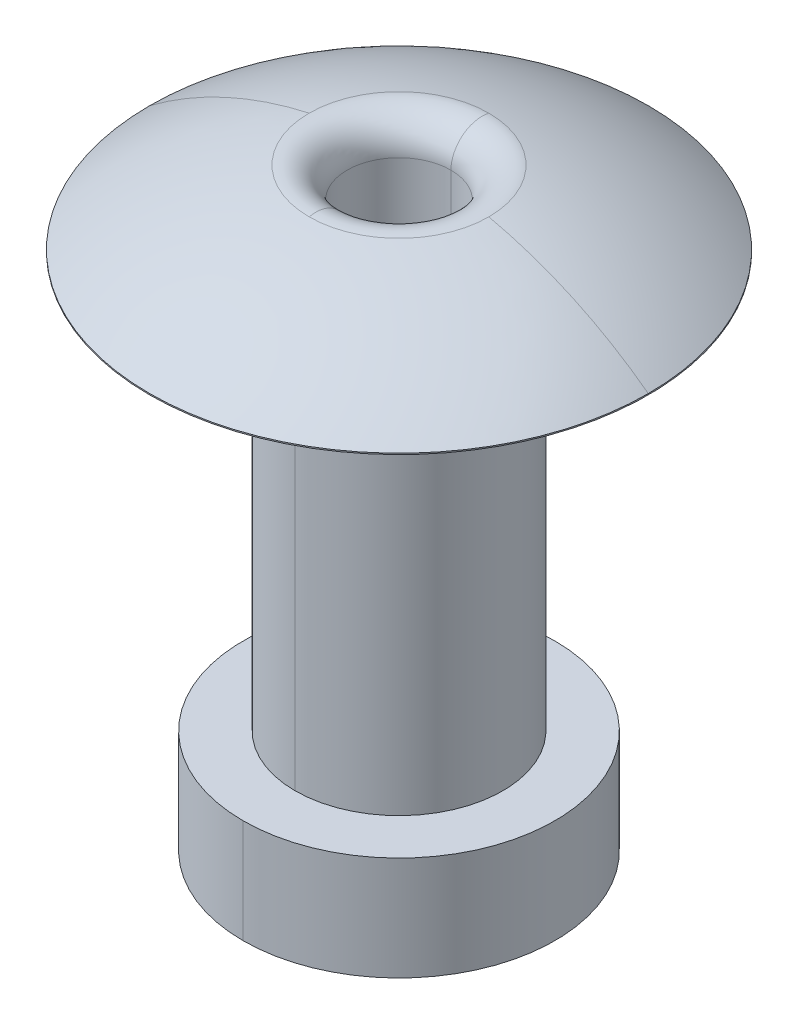
ISO-10303-21;
HEADER;
FILE_DESCRIPTION(('STEP AP214'),'2;1');
FILE_NAME('part.step','',(''),(''),'','','');
FILE_SCHEMA(('AUTOMOTIVE_DESIGN { 1 0 10303 214 1 1 1 1 }'));
ENDSEC;
DATA;
#1=APPLICATION_CONTEXT('core data for automotive mechanical design processes');
#2=APPLICATION_PROTOCOL_DEFINITION('international standard','automotive_design',2000,#1);
#3=PRODUCT_CONTEXT('',#1,'mechanical');
#4=PRODUCT('Part','Part','',(#3));
#5=PRODUCT_RELATED_PRODUCT_CATEGORY('part','',(#4));
#6=PRODUCT_DEFINITION_FORMATION('','',#4);
#7=PRODUCT_DEFINITION_CONTEXT('part definition',#1,'design');
#8=PRODUCT_DEFINITION('design','',#6,#7);
#9=PRODUCT_DEFINITION_SHAPE('','',#8);
#10=(LENGTH_UNIT() NAMED_UNIT(*) SI_UNIT(.MILLI.,.METRE.));
#11=(NAMED_UNIT(*) PLANE_ANGLE_UNIT() SI_UNIT($,.RADIAN.));
#12=(NAMED_UNIT(*) SI_UNIT($,.STERADIAN.) SOLID_ANGLE_UNIT());
#13=UNCERTAINTY_MEASURE_WITH_UNIT(LENGTH_MEASURE(1.E-05),#10,'distance_accuracy_value','');
#14=(GEOMETRIC_REPRESENTATION_CONTEXT(3) GLOBAL_UNCERTAINTY_ASSIGNED_CONTEXT((#13)) GLOBAL_UNIT_ASSIGNED_CONTEXT((#10,
#11,#12)) REPRESENTATION_CONTEXT('',''));
#15=CARTESIAN_POINT('',(0.,0.,0.));
#16=DIRECTION('',(0.,0.,1.));
#17=DIRECTION('',(1.,0.,0.));
#18=AXIS2_PLACEMENT_3D('',#15,#16,#17);
#19=CARTESIAN_POINT('',(0.,14.1684801374691,0.));
#20=DIRECTION('',(0.,-1.,0.));
#21=DIRECTION('',(0.,0.,-1.));
#22=AXIS2_PLACEMENT_3D('',#19,#20,#21);
#23=TOROIDAL_SURFACE('',#22,0.8,0.3);
#24=CARTESIAN_POINT('',(0.,14.1684801374691,0.));
#25=DIRECTION('',(0.,1.,0.));
#26=DIRECTION('',(0.,0.,-1.));
#27=AXIS2_PLACEMENT_3D('',#24,#25,#26);
#28=CIRCLE('',#27,0.5);
#29=CARTESIAN_POINT('',(0.,14.1684801374691,0.5));
#30=VERTEX_POINT('',#29);
#31=CARTESIAN_POINT('',(0.,14.1684801374691,-0.5));
#32=VERTEX_POINT('',#31);
#33=EDGE_CURVE('E40',#30,#32,#28,.T.);
#34=ORIENTED_EDGE('',*,*,#33,.F.);
#35=CARTESIAN_POINT('',(0.,14.1684801374691,0.8));
#36=DIRECTION('',(1.,0.,0.));
#37=DIRECTION('',(0.,0.,-1.));
#38=AXIS2_PLACEMENT_3D('',#35,#36,#37);
#39=CIRCLE('',#38,0.3);
#40=CARTESIAN_POINT('',(0.,14.4613837893857,0.864864864864864));
#41=VERTEX_POINT('',#40);
#42=EDGE_CURVE('E10',#30,#41,#39,.T.);
#43=ORIENTED_EDGE('',*,*,#42,.T.);
#44=CARTESIAN_POINT('',(0.,14.4613837893857,0.));
#45=DIRECTION('',(0.,-1.,0.));
#46=DIRECTION('',(0.,0.,-1.));
#47=AXIS2_PLACEMENT_3D('',#44,#45,#46);
#48=CIRCLE('',#47,0.864864864864865);
#49=CARTESIAN_POINT('',(0.864864864864865,14.4613837893857,0.));
#50=VERTEX_POINT('',#49);
#51=EDGE_CURVE('E155',#50,#41,#48,.T.);
#52=ORIENTED_EDGE('',*,*,#51,.F.);
#53=CARTESIAN_POINT('',(0.,14.4613837893857,0.));
#54=DIRECTION('',(0.,-1.,0.));
#55=DIRECTION('',(0.,0.,-1.));
#56=AXIS2_PLACEMENT_3D('',#53,#54,#55);
#57=CIRCLE('',#56,0.864864864864865);
#58=CARTESIAN_POINT('',(0.,14.4613837893857,-0.864864864864871));
#59=VERTEX_POINT('',#58);
#60=EDGE_CURVE('E201',#59,#50,#57,.T.);
#61=ORIENTED_EDGE('',*,*,#60,.F.);
#62=CARTESIAN_POINT('',(0.,14.1684801374691,-0.8));
#63=DIRECTION('',(-1.,0.,0.));
#64=DIRECTION('',(0.,0.,1.));
#65=AXIS2_PLACEMENT_3D('',#62,#63,#64);
#66=CIRCLE('',#65,0.3);
#67=EDGE_CURVE('E178',#32,#59,#66,.T.);
#68=ORIENTED_EDGE('',*,*,#67,.F.);
#69=EDGE_LOOP('',(#34,#43,#52,#61,#68));
#70=FACE_BOUND('',#69,.T.);
#71=ADVANCED_FACE('F15',(#70),#23,.T.);
#72=CARTESIAN_POINT('',(0.,0.,0.));
#73=DIRECTION('',(0.,-1.,0.));
#74=DIRECTION('',(0.,0.,-1.));
#75=AXIS2_PLACEMENT_3D('',#72,#73,#74);
#76=CYLINDRICAL_SURFACE('',#75,1.5);
#77=CARTESIAN_POINT('',(0.,9.74421133582024,0.));
#78=DIRECTION('',(0.,-1.,0.));
#79=DIRECTION('',(0.,0.,-1.));
#80=AXIS2_PLACEMENT_3D('',#77,#78,#79);
#81=CIRCLE('',#80,1.5);
#82=CARTESIAN_POINT('',(0.,9.74421133582024,-1.5));
#83=VERTEX_POINT('',#82);
#84=CARTESIAN_POINT('',(0.,9.74421133582024,1.5));
#85=VERTEX_POINT('',#84);
#86=EDGE_CURVE('E26',#83,#85,#81,.T.);
#87=ORIENTED_EDGE('',*,*,#86,.T.);
#88=DIRECTION('',(0.,-1.,0.));
#89=VECTOR('',#88,1.);
#90=CARTESIAN_POINT('',(0.,0.,1.5));
#91=LINE('',#90,#89);
#92=CARTESIAN_POINT('',(0.,8.74421133582024,1.5));
#93=VERTEX_POINT('',#92);
#94=EDGE_CURVE('E98',#85,#93,#91,.T.);
#95=ORIENTED_EDGE('',*,*,#94,.T.);
#96=CARTESIAN_POINT('',(0.,8.74421133582024,0.));
#97=DIRECTION('',(0.,-1.,0.));
#98=DIRECTION('',(0.,0.,-1.));
#99=AXIS2_PLACEMENT_3D('',#96,#97,#98);
#100=CIRCLE('',#99,1.5);
#101=CARTESIAN_POINT('',(0.,8.74421133582024,-1.5));
#102=VERTEX_POINT('',#101);
#103=EDGE_CURVE('E88',#102,#93,#100,.T.);
#104=ORIENTED_EDGE('',*,*,#103,.F.);
#105=DIRECTION('',(0.,-1.,0.));
#106=VECTOR('',#105,1.);
#107=CARTESIAN_POINT('',(0.,0.,-1.5));
#108=LINE('',#107,#106);
#109=EDGE_CURVE('E249',#83,#102,#108,.T.);
#110=ORIENTED_EDGE('',*,*,#109,.F.);
#111=EDGE_LOOP('',(#87,#95,#104,#110));
#112=FACE_BOUND('',#111,.T.);
#113=ADVANCED_FACE('F378',(#112),#76,.T.);
#114=CARTESIAN_POINT('',(0.,0.,0.));
#115=DIRECTION('',(0.,-1.,0.));
#116=DIRECTION('',(0.,0.,-1.));
#117=AXIS2_PLACEMENT_3D('',#114,#115,#116);
#118=CYLINDRICAL_SURFACE('',#117,1.);
#119=CARTESIAN_POINT('',(0.,13.7442113358202,0.));
#120=DIRECTION('',(0.,-1.,0.));
#121=DIRECTION('',(0.,0.,-1.));
#122=AXIS2_PLACEMENT_3D('',#119,#120,#121);
#123=CIRCLE('',#122,1.);
#124=CARTESIAN_POINT('',(0.,13.7442113358202,-1.));
#125=VERTEX_POINT('',#124);
#126=CARTESIAN_POINT('',(0.,13.7442113358202,1.));
#127=VERTEX_POINT('',#126);
#128=EDGE_CURVE('E170',#125,#127,#123,.T.);
#129=ORIENTED_EDGE('',*,*,#128,.T.);
#130=DIRECTION('',(0.,-1.,0.));
#131=VECTOR('',#130,1.);
#132=CARTESIAN_POINT('',(0.,0.,1.));
#133=LINE('',#132,#131);
#134=CARTESIAN_POINT('',(0.,9.74421133582024,1.));
#135=VERTEX_POINT('',#134);
#136=EDGE_CURVE('E191',#127,#135,#133,.T.);
#137=ORIENTED_EDGE('',*,*,#136,.T.);
#138=CARTESIAN_POINT('',(0.,9.74421133582024,0.));
#139=DIRECTION('',(0.,-1.,0.));
#140=DIRECTION('',(0.,0.,-1.));
#141=AXIS2_PLACEMENT_3D('',#138,#139,#140);
#142=CIRCLE('',#141,1.);
#143=CARTESIAN_POINT('',(0.,9.74421133582024,-1.));
#144=VERTEX_POINT('',#143);
#145=EDGE_CURVE('E214',#144,#135,#142,.T.);
#146=ORIENTED_EDGE('',*,*,#145,.F.);
#147=DIRECTION('',(0.,-1.,0.));
#148=VECTOR('',#147,1.);
#149=CARTESIAN_POINT('',(0.,0.,-1.));
#150=LINE('',#149,#148);
#151=EDGE_CURVE('E177',#125,#144,#150,.T.);
#152=ORIENTED_EDGE('',*,*,#151,.F.);
#153=EDGE_LOOP('',(#129,#137,#146,#152));
#154=FACE_BOUND('',#153,.T.);
#155=ADVANCED_FACE('F422',(#154),#118,.T.);
#156=CARTESIAN_POINT('',(0.,0.,0.));
#157=DIRECTION('',(0.,-1.,0.));
#158=DIRECTION('',(0.,0.,-1.));
#159=AXIS2_PLACEMENT_3D('',#156,#157,#158);
#160=CYLINDRICAL_SURFACE('',#159,2.4);
#161=CARTESIAN_POINT('',(0.,13.7560017638314,0.));
#162=DIRECTION('',(0.,-1.,0.));
#163=DIRECTION('',(0.,0.,-1.));
#164=AXIS2_PLACEMENT_3D('',#161,#162,#163);
#165=CIRCLE('',#164,2.4);
#166=CARTESIAN_POINT('',(2.4,13.7560017638314,0.));
#167=VERTEX_POINT('',#166);
#168=CARTESIAN_POINT('',(0.,13.7560017638314,2.4));
#169=VERTEX_POINT('',#168);
#170=EDGE_CURVE('E192',#167,#169,#165,.T.);
#171=ORIENTED_EDGE('',*,*,#170,.T.);
#172=DIRECTION('',(0.,-1.,0.));
#173=VECTOR('',#172,1.);
#174=CARTESIAN_POINT('',(0.,0.,2.4));
#175=LINE('',#174,#173);
#176=CARTESIAN_POINT('',(0.,13.7442113358202,2.4));
#177=VERTEX_POINT('',#176);
#178=EDGE_CURVE('E195',#169,#177,#175,.T.);
#179=ORIENTED_EDGE('',*,*,#178,.T.);
#180=CARTESIAN_POINT('',(0.,13.7442113358202,0.));
#181=DIRECTION('',(0.,-1.,0.));
#182=DIRECTION('',(0.,0.,-1.));
#183=AXIS2_PLACEMENT_3D('',#180,#181,#182);
#184=CIRCLE('',#183,2.4);
#185=CARTESIAN_POINT('',(0.,13.7442113358202,-2.4));
#186=VERTEX_POINT('',#185);
#187=EDGE_CURVE('E182',#186,#177,#184,.T.);
#188=ORIENTED_EDGE('',*,*,#187,.F.);
#189=DIRECTION('',(0.,-1.,0.));
#190=VECTOR('',#189,1.);
#191=CARTESIAN_POINT('',(0.,0.,-2.4));
#192=LINE('',#191,#190);
#193=CARTESIAN_POINT('',(0.,13.7560017638314,-2.4));
#194=VERTEX_POINT('',#193);
#195=EDGE_CURVE('E185',#194,#186,#192,.T.);
#196=ORIENTED_EDGE('',*,*,#195,.F.);
#197=CARTESIAN_POINT('',(0.,13.7560017638314,0.));
#198=DIRECTION('',(0.,-1.,0.));
#199=DIRECTION('',(0.,0.,-1.));
#200=AXIS2_PLACEMENT_3D('',#197,#198,#199);
#201=CIRCLE('',#200,2.4);
#202=EDGE_CURVE('E19',#194,#167,#201,.T.);
#203=ORIENTED_EDGE('',*,*,#202,.T.);
#204=EDGE_LOOP('',(#171,#179,#188,#196,#203));
#205=FACE_BOUND('',#204,.T.);
#206=ADVANCED_FACE('F414',(#205),#160,.T.);
#207=CARTESIAN_POINT('',(0.,10.5560017638314,0.));
#208=DIRECTION('',(0.,0.,-1.));
#209=DIRECTION('',(-1.,0.,0.));
#210=AXIS2_PLACEMENT_3D('',#207,#208,#209);
#211=SPHERICAL_SURFACE('',#210,4.);
#212=CARTESIAN_POINT('',(0.,14.4613837893857,0.));
#213=DIRECTION('',(0.,-1.,0.));
#214=DIRECTION('',(0.,0.,-1.));
#215=AXIS2_PLACEMENT_3D('',#212,#213,#214);
#216=CIRCLE('',#215,0.864864864864865);
#217=CARTESIAN_POINT('',(-0.864864864864865,14.4613837893857,0.));
#218=VERTEX_POINT('',#217);
#219=EDGE_CURVE('E197',#218,#59,#216,.T.);
#220=ORIENTED_EDGE('',*,*,#219,.T.);
#221=ORIENTED_EDGE('',*,*,#60,.T.);
#222=CARTESIAN_POINT('',(0.,10.5560017638314,0.));
#223=DIRECTION('',(0.,0.,-1.));
#224=DIRECTION('',(-1.,0.,0.));
#225=AXIS2_PLACEMENT_3D('',#222,#223,#224);
#226=CIRCLE('',#225,4.);
#227=EDGE_CURVE('E245',#50,#167,#226,.T.);
#228=ORIENTED_EDGE('',*,*,#227,.T.);
#229=ORIENTED_EDGE('',*,*,#202,.F.);
#230=CARTESIAN_POINT('',(0.,13.7560017638314,0.));
#231=DIRECTION('',(0.,-1.,0.));
#232=DIRECTION('',(0.,0.,-1.));
#233=AXIS2_PLACEMENT_3D('',#230,#231,#232);
#234=CIRCLE('',#233,2.4);
#235=CARTESIAN_POINT('',(-2.4,13.7560017638314,0.));
#236=VERTEX_POINT('',#235);
#237=EDGE_CURVE('E202',#236,#194,#234,.T.);
#238=ORIENTED_EDGE('',*,*,#237,.F.);
#239=CARTESIAN_POINT('',(0.,10.5560017638314,0.));
#240=DIRECTION('',(0.,0.,1.));
#241=DIRECTION('',(1.,0.,0.));
#242=AXIS2_PLACEMENT_3D('',#239,#240,#241);
#243=CIRCLE('',#242,4.);
#244=EDGE_CURVE('E210',#218,#236,#243,.T.);
#245=ORIENTED_EDGE('',*,*,#244,.F.);
#246=EDGE_LOOP('',(#220,#221,#228,#229,#238,#245));
#247=FACE_BOUND('',#246,.T.);
#248=ADVANCED_FACE('F389',(#247),#211,.T.);
#249=CARTESIAN_POINT('',(0.,0.,0.));
#250=DIRECTION('',(0.,-1.,0.));
#251=DIRECTION('',(0.,0.,-1.));
#252=AXIS2_PLACEMENT_3D('',#249,#250,#251);
#253=CYLINDRICAL_SURFACE('',#252,0.5);
#254=CARTESIAN_POINT('',(0.,14.1684801374691,0.));
#255=DIRECTION('',(0.,1.,0.));
#256=DIRECTION('',(0.,0.,-1.));
#257=AXIS2_PLACEMENT_3D('',#254,#255,#256);
#258=CIRCLE('',#257,0.5);
#259=EDGE_CURVE('E165',#32,#30,#258,.T.);
#260=ORIENTED_EDGE('',*,*,#259,.T.);
#261=DIRECTION('',(0.,-1.,0.));
#262=VECTOR('',#261,1.);
#263=CARTESIAN_POINT('',(0.,0.,0.5));
#264=LINE('',#263,#262);
#265=CARTESIAN_POINT('',(0.,12.0246287304283,0.5));
#266=VERTEX_POINT('',#265);
#267=EDGE_CURVE('E149',#30,#266,#264,.T.);
#268=ORIENTED_EDGE('',*,*,#267,.T.);
#269=CARTESIAN_POINT('',(0.,12.0246287304283,0.));
#270=DIRECTION('',(0.,-1.,0.));
#271=DIRECTION('',(0.,0.,-1.));
#272=AXIS2_PLACEMENT_3D('',#269,#270,#271);
#273=CIRCLE('',#272,0.5);
#274=CARTESIAN_POINT('',(0.,12.0246287304283,-0.5));
#275=VERTEX_POINT('',#274);
#276=EDGE_CURVE('E147',#266,#275,#273,.T.);
#277=ORIENTED_EDGE('',*,*,#276,.T.);
#278=DIRECTION('',(0.,-1.,0.));
#279=VECTOR('',#278,1.);
#280=CARTESIAN_POINT('',(0.,0.,-0.5));
#281=LINE('',#280,#279);
#282=EDGE_CURVE('E136',#32,#275,#281,.T.);
#283=ORIENTED_EDGE('',*,*,#282,.F.);
#284=EDGE_LOOP('',(#260,#268,#277,#283));
#285=FACE_BOUND('',#284,.T.);
#286=ADVANCED_FACE('F148',(#285),#253,.F.);
#287=CARTESIAN_POINT('',(0.,12.0246287304283,0.));
#288=DIRECTION('',(0.,-1.,0.));
#289=DIRECTION('',(0.,0.,-1.));
#290=AXIS2_PLACEMENT_3D('',#287,#288,#289);
#291=PLANE('',#290);
#292=CARTESIAN_POINT('',(0.,12.0246287304283,0.));
#293=DIRECTION('',(0.,-1.,0.));
#294=DIRECTION('',(0.,0.,-1.));
#295=AXIS2_PLACEMENT_3D('',#292,#293,#294);
#296=CIRCLE('',#295,0.5);
#297=EDGE_CURVE('E141',#275,#266,#296,.T.);
#298=ORIENTED_EDGE('',*,*,#297,.F.);
#299=ORIENTED_EDGE('',*,*,#276,.F.);
#300=EDGE_LOOP('',(#298,#299));
#301=FACE_BOUND('',#300,.T.);
#302=ADVANCED_FACE('F153',(#301),#291,.F.);
#303=CARTESIAN_POINT('',(0.,0.,0.));
#304=DIRECTION('',(0.,-1.,0.));
#305=DIRECTION('',(0.,0.,-1.));
#306=AXIS2_PLACEMENT_3D('',#303,#304,#305);
#307=CYLINDRICAL_SURFACE('',#306,0.5);
#308=ORIENTED_EDGE('',*,*,#267,.F.);
#309=ORIENTED_EDGE('',*,*,#33,.T.);
#310=ORIENTED_EDGE('',*,*,#282,.T.);
#311=ORIENTED_EDGE('',*,*,#297,.T.);
#312=EDGE_LOOP('',(#308,#309,#310,#311));
#313=FACE_BOUND('',#312,.T.);
#314=ADVANCED_FACE('F139',(#313),#307,.F.);
#315=CARTESIAN_POINT('',(0.,10.5560017638314,0.));
#316=DIRECTION('',(0.,0.,-1.));
#317=DIRECTION('',(-1.,0.,0.));
#318=AXIS2_PLACEMENT_3D('',#315,#316,#317);
#319=SPHERICAL_SURFACE('',#318,4.);
#320=ORIENTED_EDGE('',*,*,#227,.F.);
#321=ORIENTED_EDGE('',*,*,#51,.T.);
#322=CARTESIAN_POINT('',(0.,14.4613837893857,0.));
#323=DIRECTION('',(0.,-1.,0.));
#324=DIRECTION('',(0.,0.,-1.));
#325=AXIS2_PLACEMENT_3D('',#322,#323,#324);
#326=CIRCLE('',#325,0.864864864864865);
#327=EDGE_CURVE('E161',#41,#218,#326,.T.);
#328=ORIENTED_EDGE('',*,*,#327,.T.);
#329=ORIENTED_EDGE('',*,*,#244,.T.);
#330=CARTESIAN_POINT('',(0.,13.7560017638314,0.));
#331=DIRECTION('',(0.,-1.,0.));
#332=DIRECTION('',(0.,0.,-1.));
#333=AXIS2_PLACEMENT_3D('',#330,#331,#332);
#334=CIRCLE('',#333,2.4);
#335=EDGE_CURVE('E206',#169,#236,#334,.T.);
#336=ORIENTED_EDGE('',*,*,#335,.F.);
#337=ORIENTED_EDGE('',*,*,#170,.F.);
#338=EDGE_LOOP('',(#320,#321,#328,#329,#336,#337));
#339=FACE_BOUND('',#338,.T.);
#340=ADVANCED_FACE('F17',(#339),#319,.T.);
#341=CARTESIAN_POINT('',(0.,0.,0.));
#342=DIRECTION('',(0.,-1.,0.));
#343=DIRECTION('',(0.,0.,-1.));
#344=AXIS2_PLACEMENT_3D('',#341,#342,#343);
#345=CYLINDRICAL_SURFACE('',#344,2.4);
#346=ORIENTED_EDGE('',*,*,#178,.F.);
#347=ORIENTED_EDGE('',*,*,#335,.T.);
#348=ORIENTED_EDGE('',*,*,#237,.T.);
#349=ORIENTED_EDGE('',*,*,#195,.T.);
#350=CARTESIAN_POINT('',(0.,13.7442113358202,0.));
#351=DIRECTION('',(0.,-1.,0.));
#352=DIRECTION('',(0.,0.,-1.));
#353=AXIS2_PLACEMENT_3D('',#350,#351,#352);
#354=CIRCLE('',#353,2.4);
#355=EDGE_CURVE('E176',#177,#186,#354,.T.);
#356=ORIENTED_EDGE('',*,*,#355,.F.);
#357=EDGE_LOOP('',(#346,#347,#348,#349,#356));
#358=FACE_BOUND('',#357,.T.);
#359=ADVANCED_FACE('F397',(#358),#345,.T.);
#360=CARTESIAN_POINT('',(-2.4,13.7442113358202,0.));
#361=DIRECTION('',(0.,1.,0.));
#362=DIRECTION('',(1.,0.,0.));
#363=AXIS2_PLACEMENT_3D('',#360,#361,#362);
#364=PLANE('',#363);
#365=ORIENTED_EDGE('',*,*,#187,.T.);
#366=ORIENTED_EDGE('',*,*,#355,.T.);
#367=EDGE_LOOP('',(#365,#366));
#368=FACE_BOUND('',#367,.T.);
#369=ORIENTED_EDGE('',*,*,#128,.F.);
#370=CARTESIAN_POINT('',(0.,13.7442113358202,0.));
#371=DIRECTION('',(0.,-1.,0.));
#372=DIRECTION('',(0.,0.,-1.));
#373=AXIS2_PLACEMENT_3D('',#370,#371,#372);
#374=CIRCLE('',#373,1.);
#375=EDGE_CURVE('E172',#127,#125,#374,.T.);
#376=ORIENTED_EDGE('',*,*,#375,.F.);
#377=EDGE_LOOP('',(#369,#376));
#378=FACE_BOUND('',#377,.T.);
#379=ADVANCED_FACE('F402',(#368,#378),#364,.F.);
#380=CARTESIAN_POINT('',(0.,0.,0.));
#381=DIRECTION('',(0.,-1.,0.));
#382=DIRECTION('',(0.,0.,-1.));
#383=AXIS2_PLACEMENT_3D('',#380,#381,#382);
#384=CYLINDRICAL_SURFACE('',#383,1.);
#385=ORIENTED_EDGE('',*,*,#136,.F.);
#386=ORIENTED_EDGE('',*,*,#375,.T.);
#387=ORIENTED_EDGE('',*,*,#151,.T.);
#388=CARTESIAN_POINT('',(0.,9.74421133582024,0.));
#389=DIRECTION('',(0.,-1.,0.));
#390=DIRECTION('',(0.,0.,-1.));
#391=AXIS2_PLACEMENT_3D('',#388,#389,#390);
#392=CIRCLE('',#391,1.);
#393=EDGE_CURVE('E221',#135,#144,#392,.T.);
#394=ORIENTED_EDGE('',*,*,#393,.F.);
#395=EDGE_LOOP('',(#385,#386,#387,#394));
#396=FACE_BOUND('',#395,.T.);
#397=ADVANCED_FACE('F454',(#396),#384,.T.);
#398=CARTESIAN_POINT('',(-1.,9.74421133582024,0.));
#399=DIRECTION('',(0.,-1.,0.));
#400=DIRECTION('',(0.,0.,-1.));
#401=AXIS2_PLACEMENT_3D('',#398,#399,#400);
#402=PLANE('',#401);
#403=ORIENTED_EDGE('',*,*,#86,.F.);
#404=CARTESIAN_POINT('',(0.,9.74421133582024,0.));
#405=DIRECTION('',(0.,-1.,0.));
#406=DIRECTION('',(0.,0.,-1.));
#407=AXIS2_PLACEMENT_3D('',#404,#405,#406);
#408=CIRCLE('',#407,1.5);
#409=EDGE_CURVE('E225',#85,#83,#408,.T.);
#410=ORIENTED_EDGE('',*,*,#409,.F.);
#411=EDGE_LOOP('',(#403,#410));
#412=FACE_BOUND('',#411,.T.);
#413=ORIENTED_EDGE('',*,*,#145,.T.);
#414=ORIENTED_EDGE('',*,*,#393,.T.);
#415=EDGE_LOOP('',(#413,#414));
#416=FACE_BOUND('',#415,.T.);
#417=ADVANCED_FACE('F462',(#412,#416),#402,.F.);
#418=CARTESIAN_POINT('',(0.,0.,0.));
#419=DIRECTION('',(0.,-1.,0.));
#420=DIRECTION('',(0.,0.,-1.));
#421=AXIS2_PLACEMENT_3D('',#418,#419,#420);
#422=CYLINDRICAL_SURFACE('',#421,1.5);
#423=ORIENTED_EDGE('',*,*,#94,.F.);
#424=ORIENTED_EDGE('',*,*,#409,.T.);
#425=ORIENTED_EDGE('',*,*,#109,.T.);
#426=CARTESIAN_POINT('',(0.,8.74421133582024,0.));
#427=DIRECTION('',(0.,-1.,0.));
#428=DIRECTION('',(0.,0.,-1.));
#429=AXIS2_PLACEMENT_3D('',#426,#427,#428);
#430=CIRCLE('',#429,1.5);
#431=EDGE_CURVE('E181',#93,#102,#430,.T.);
#432=ORIENTED_EDGE('',*,*,#431,.F.);
#433=EDGE_LOOP('',(#423,#424,#425,#432));
#434=FACE_BOUND('',#433,.T.);
#435=ADVANCED_FACE('F467',(#434),#422,.T.);
#436=CARTESIAN_POINT('',(-1.5,8.74421133582024,0.));
#437=DIRECTION('',(0.,1.,0.));
#438=DIRECTION('',(1.,0.,0.));
#439=AXIS2_PLACEMENT_3D('',#436,#437,#438);
#440=PLANE('',#439);
#441=ORIENTED_EDGE('',*,*,#103,.T.);
#442=ORIENTED_EDGE('',*,*,#431,.T.);
#443=EDGE_LOOP('',(#441,#442));
#444=FACE_BOUND('',#443,.T.);
#445=ADVANCED_FACE('F493',(#444),#440,.F.);
#446=CARTESIAN_POINT('',(0.,14.1684801374691,0.));
#447=DIRECTION('',(0.,-1.,0.));
#448=DIRECTION('',(0.,0.,-1.));
#449=AXIS2_PLACEMENT_3D('',#446,#447,#448);
#450=TOROIDAL_SURFACE('',#449,0.8,0.3);
#451=ORIENTED_EDGE('',*,*,#42,.F.);
#452=ORIENTED_EDGE('',*,*,#259,.F.);
#453=ORIENTED_EDGE('',*,*,#67,.T.);
#454=ORIENTED_EDGE('',*,*,#219,.F.);
#455=ORIENTED_EDGE('',*,*,#327,.F.);
#456=EDGE_LOOP('',(#451,#452,#453,#454,#455));
#457=FACE_BOUND('',#456,.T.);
#458=ADVANCED_FACE('F498',(#457),#450,.T.);
#459=CLOSED_SHELL('',(#71,#113,#155,#206,#248,#286,#302,#314,#340,#359,#379,#397,#417,#435,#445,#458));
#460=MANIFOLD_SOLID_BREP('B1',#459);
#461=ADVANCED_BREP_SHAPE_REPRESENTATION('',(#18,#460),#14);
#462=SHAPE_DEFINITION_REPRESENTATION(#9,#461);
ENDSEC;
END-ISO-10303-21;
